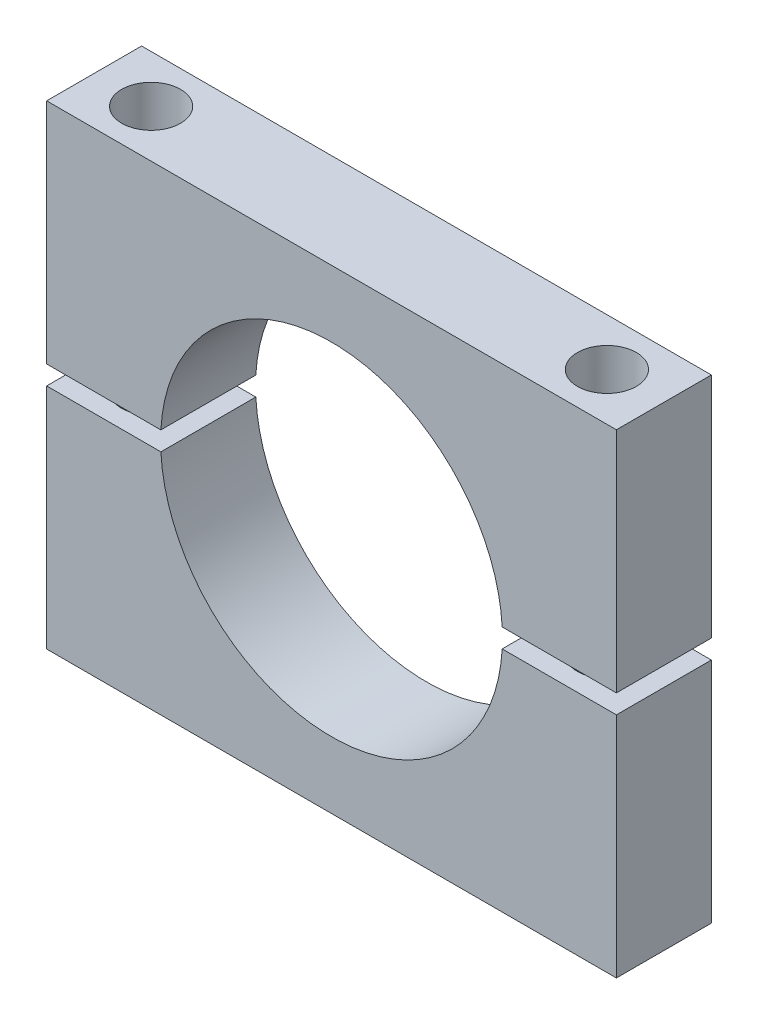
ISO-10303-21;
HEADER;
FILE_DESCRIPTION(('STEP AP214'),'2;1');
FILE_NAME('part.step','',(''),(''),'','','');
FILE_SCHEMA(('AUTOMOTIVE_DESIGN { 1 0 10303 214 1 1 1 1 }'));
ENDSEC;
DATA;
#1=APPLICATION_CONTEXT('core data for automotive mechanical design processes');
#2=APPLICATION_PROTOCOL_DEFINITION('international standard','automotive_design',2000,#1);
#3=PRODUCT_CONTEXT('',#1,'mechanical');
#4=PRODUCT('Part','Part','',(#3));
#5=PRODUCT_RELATED_PRODUCT_CATEGORY('part','',(#4));
#6=PRODUCT_DEFINITION_FORMATION('','',#4);
#7=PRODUCT_DEFINITION_CONTEXT('part definition',#1,'design');
#8=PRODUCT_DEFINITION('design','',#6,#7);
#9=PRODUCT_DEFINITION_SHAPE('','',#8);
#10=(LENGTH_UNIT() NAMED_UNIT(*) SI_UNIT(.MILLI.,.METRE.));
#11=(NAMED_UNIT(*) PLANE_ANGLE_UNIT() SI_UNIT($,.RADIAN.));
#12=(NAMED_UNIT(*) SI_UNIT($,.STERADIAN.) SOLID_ANGLE_UNIT());
#13=UNCERTAINTY_MEASURE_WITH_UNIT(LENGTH_MEASURE(1.E-05),#10,'distance_accuracy_value','');
#14=(GEOMETRIC_REPRESENTATION_CONTEXT(3) GLOBAL_UNCERTAINTY_ASSIGNED_CONTEXT((#13)) GLOBAL_UNIT_ASSIGNED_CONTEXT((#10,
#11,#12)) REPRESENTATION_CONTEXT('',''));
#15=CARTESIAN_POINT('',(0.,0.,0.));
#16=DIRECTION('',(0.,0.,1.));
#17=DIRECTION('',(1.,0.,0.));
#18=AXIS2_PLACEMENT_3D('',#15,#16,#17);
#19=CARTESIAN_POINT('',(15.,25.,2.5));
#20=DIRECTION('',(0.,0.,-1.));
#21=DIRECTION('',(-1.,0.,0.));
#22=AXIS2_PLACEMENT_3D('',#19,#20,#21);
#23=PLANE('',#22);
#24=DIRECTION('',(0.,-1.,0.));
#25=VECTOR('',#24,1.);
#26=CARTESIAN_POINT('',(-15.,25.,2.5));
#27=LINE('',#26,#25);
#28=CARTESIAN_POINT('',(-15.,25.,2.5));
#29=VERTEX_POINT('',#28);
#30=CARTESIAN_POINT('',(-15.,13.,2.5));
#31=VERTEX_POINT('',#30);
#32=EDGE_CURVE('E129',#29,#31,#27,.T.);
#33=ORIENTED_EDGE('',*,*,#32,.T.);
#34=DIRECTION('',(-1.,0.,0.));
#35=VECTOR('',#34,1.);
#36=CARTESIAN_POINT('',(-15.,13.,2.5));
#37=LINE('',#36,#35);
#38=CARTESIAN_POINT('',(-8.98610037780571,13.,2.5));
#39=VERTEX_POINT('',#38);
#40=EDGE_CURVE('E139',#39,#31,#37,.T.);
#41=ORIENTED_EDGE('',*,*,#40,.F.);
#42=CARTESIAN_POINT('',(0.,12.5,2.5));
#43=DIRECTION('',(0.,0.,1.));
#44=DIRECTION('',(1.,0.,0.));
#45=AXIS2_PLACEMENT_3D('',#42,#43,#44);
#46=CIRCLE('',#45,9.);
#47=CARTESIAN_POINT('',(8.98610037780572,13.,2.5));
#48=VERTEX_POINT('',#47);
#49=EDGE_CURVE('E137',#48,#39,#46,.T.);
#50=ORIENTED_EDGE('',*,*,#49,.F.);
#51=DIRECTION('',(-1.,0.,0.));
#52=VECTOR('',#51,1.);
#53=CARTESIAN_POINT('',(8.98610037780572,13.,2.5));
#54=LINE('',#53,#52);
#55=CARTESIAN_POINT('',(15.,13.,2.5));
#56=VERTEX_POINT('',#55);
#57=EDGE_CURVE('E12',#56,#48,#54,.T.);
#58=ORIENTED_EDGE('',*,*,#57,.F.);
#59=DIRECTION('',(0.,-1.,0.));
#60=VECTOR('',#59,1.);
#61=CARTESIAN_POINT('',(15.,25.,2.5));
#62=LINE('',#61,#60);
#63=CARTESIAN_POINT('',(15.,25.,2.5));
#64=VERTEX_POINT('',#63);
#65=EDGE_CURVE('E144',#64,#56,#62,.T.);
#66=ORIENTED_EDGE('',*,*,#65,.F.);
#67=DIRECTION('',(1.,0.,0.));
#68=VECTOR('',#67,1.);
#69=CARTESIAN_POINT('',(15.,25.,2.5));
#70=LINE('',#69,#68);
#71=EDGE_CURVE('E130',#29,#64,#70,.T.);
#72=ORIENTED_EDGE('',*,*,#71,.F.);
#73=EDGE_LOOP('',(#33,#41,#50,#58,#66,#72));
#74=FACE_BOUND('',#73,.T.);
#75=ADVANCED_FACE('F48',(#74),#23,.F.);
#76=CARTESIAN_POINT('',(15.,25.,2.5));
#77=DIRECTION('',(-1.,0.,0.));
#78=DIRECTION('',(0.,0.,1.));
#79=AXIS2_PLACEMENT_3D('',#76,#77,#78);
#80=PLANE('',#79);
#81=ORIENTED_EDGE('',*,*,#65,.T.);
#82=DIRECTION('',(0.,0.,1.));
#83=VECTOR('',#82,1.);
#84=CARTESIAN_POINT('',(15.,13.,-18.5));
#85=LINE('',#84,#83);
#86=CARTESIAN_POINT('',(15.,13.,-2.50000000000001));
#87=VERTEX_POINT('',#86);
#88=EDGE_CURVE('E58',#87,#56,#85,.T.);
#89=ORIENTED_EDGE('',*,*,#88,.F.);
#90=DIRECTION('',(0.,-1.,0.));
#91=VECTOR('',#90,1.);
#92=CARTESIAN_POINT('',(15.,25.,-2.5));
#93=LINE('',#92,#91);
#94=CARTESIAN_POINT('',(15.,25.,-2.5));
#95=VERTEX_POINT('',#94);
#96=EDGE_CURVE('E148',#95,#87,#93,.T.);
#97=ORIENTED_EDGE('',*,*,#96,.F.);
#98=DIRECTION('',(0.,0.,-1.));
#99=VECTOR('',#98,1.);
#100=CARTESIAN_POINT('',(15.,25.,2.5));
#101=LINE('',#100,#99);
#102=EDGE_CURVE('E116',#64,#95,#101,.T.);
#103=ORIENTED_EDGE('',*,*,#102,.F.);
#104=EDGE_LOOP('',(#81,#89,#97,#103));
#105=FACE_BOUND('',#104,.T.);
#106=ADVANCED_FACE('F166',(#105),#80,.F.);
#107=CARTESIAN_POINT('',(15.,25.,-2.5));
#108=DIRECTION('',(0.,0.,1.));
#109=DIRECTION('',(1.,0.,0.));
#110=AXIS2_PLACEMENT_3D('',#107,#108,#109);
#111=PLANE('',#110);
#112=CARTESIAN_POINT('',(0.,12.5,-2.5));
#113=DIRECTION('',(0.,0.,1.));
#114=DIRECTION('',(1.,0.,0.));
#115=AXIS2_PLACEMENT_3D('',#112,#113,#114);
#116=CIRCLE('',#115,9.);
#117=CARTESIAN_POINT('',(8.98610037780572,13.,-2.5));
#118=VERTEX_POINT('',#117);
#119=CARTESIAN_POINT('',(-8.98610037780571,13.,-2.50000000000001));
#120=VERTEX_POINT('',#119);
#121=EDGE_CURVE('E147',#118,#120,#116,.T.);
#122=ORIENTED_EDGE('',*,*,#121,.T.);
#123=DIRECTION('',(-1.,0.,0.));
#124=VECTOR('',#123,1.);
#125=CARTESIAN_POINT('',(15.,13.,-2.5));
#126=LINE('',#125,#124);
#127=CARTESIAN_POINT('',(-15.,13.,-2.50000000000001));
#128=VERTEX_POINT('',#127);
#129=EDGE_CURVE('E91',#120,#128,#126,.T.);
#130=ORIENTED_EDGE('',*,*,#129,.T.);
#131=DIRECTION('',(0.,-1.,0.));
#132=VECTOR('',#131,1.);
#133=CARTESIAN_POINT('',(-15.,25.,-2.5));
#134=LINE('',#133,#132);
#135=CARTESIAN_POINT('',(-15.,25.,-2.5));
#136=VERTEX_POINT('',#135);
#137=EDGE_CURVE('E123',#136,#128,#134,.T.);
#138=ORIENTED_EDGE('',*,*,#137,.F.);
#139=DIRECTION('',(-1.,0.,0.));
#140=VECTOR('',#139,1.);
#141=CARTESIAN_POINT('',(15.,25.,-2.5));
#142=LINE('',#141,#140);
#143=EDGE_CURVE('E109',#95,#136,#142,.T.);
#144=ORIENTED_EDGE('',*,*,#143,.F.);
#145=ORIENTED_EDGE('',*,*,#96,.T.);
#146=DIRECTION('',(-1.,0.,0.));
#147=VECTOR('',#146,1.);
#148=CARTESIAN_POINT('',(15.,13.,-2.5));
#149=LINE('',#148,#147);
#150=EDGE_CURVE('E67',#87,#118,#149,.T.);
#151=ORIENTED_EDGE('',*,*,#150,.T.);
#152=EDGE_LOOP('',(#122,#130,#138,#144,#145,#151));
#153=FACE_BOUND('',#152,.T.);
#154=ADVANCED_FACE('F125',(#153),#111,.F.);
#155=CARTESIAN_POINT('',(-15.,25.,2.5));
#156=DIRECTION('',(1.,0.,0.));
#157=DIRECTION('',(0.,0.,-1.));
#158=AXIS2_PLACEMENT_3D('',#155,#156,#157);
#159=PLANE('',#158);
#160=ORIENTED_EDGE('',*,*,#137,.T.);
#161=DIRECTION('',(0.,0.,1.));
#162=VECTOR('',#161,1.);
#163=CARTESIAN_POINT('',(-15.,13.,-18.5));
#164=LINE('',#163,#162);
#165=EDGE_CURVE('E94',#128,#31,#164,.T.);
#166=ORIENTED_EDGE('',*,*,#165,.T.);
#167=ORIENTED_EDGE('',*,*,#32,.F.);
#168=DIRECTION('',(0.,0.,1.));
#169=VECTOR('',#168,1.);
#170=CARTESIAN_POINT('',(-15.,25.,2.5));
#171=LINE('',#170,#169);
#172=EDGE_CURVE('E113',#136,#29,#171,.T.);
#173=ORIENTED_EDGE('',*,*,#172,.F.);
#174=EDGE_LOOP('',(#160,#166,#167,#173));
#175=FACE_BOUND('',#174,.T.);
#176=ADVANCED_FACE('F50',(#175),#159,.F.);
#177=CARTESIAN_POINT('',(0.,25.,0.));
#178=DIRECTION('',(0.,1.,0.));
#179=DIRECTION('',(0.,0.,1.));
#180=AXIS2_PLACEMENT_3D('',#177,#178,#179);
#181=PLANE('',#180);
#182=CARTESIAN_POINT('',(-12.,25.,0.));
#183=DIRECTION('',(0.,1.,0.));
#184=DIRECTION('',(0.,0.,1.));
#185=AXIS2_PLACEMENT_3D('',#182,#183,#184);
#186=CIRCLE('',#185,1.55);
#187=CARTESIAN_POINT('',(-12.,25.,1.55));
#188=VERTEX_POINT('',#187);
#189=EDGE_CURVE('E151',#188,#188,#186,.T.);
#190=ORIENTED_EDGE('',*,*,#189,.F.);
#191=EDGE_LOOP('',(#190));
#192=FACE_BOUND('',#191,.T.);
#193=CARTESIAN_POINT('',(12.,25.,0.));
#194=DIRECTION('',(0.,1.,0.));
#195=DIRECTION('',(0.,0.,-1.));
#196=AXIS2_PLACEMENT_3D('',#193,#194,#195);
#197=CIRCLE('',#196,1.55);
#198=CARTESIAN_POINT('',(12.,25.,-1.55));
#199=VERTEX_POINT('',#198);
#200=EDGE_CURVE('E156',#199,#199,#197,.T.);
#201=ORIENTED_EDGE('',*,*,#200,.F.);
#202=EDGE_LOOP('',(#201));
#203=FACE_BOUND('',#202,.T.);
#204=ORIENTED_EDGE('',*,*,#172,.T.);
#205=ORIENTED_EDGE('',*,*,#71,.T.);
#206=ORIENTED_EDGE('',*,*,#102,.T.);
#207=ORIENTED_EDGE('',*,*,#143,.T.);
#208=EDGE_LOOP('',(#204,#205,#206,#207));
#209=FACE_BOUND('',#208,.T.);
#210=ADVANCED_FACE('F111',(#192,#203,#209),#181,.T.);
#211=CARTESIAN_POINT('',(-15.,13.,-18.5));
#212=DIRECTION('',(0.,1.,0.));
#213=DIRECTION('',(-1.,0.,0.));
#214=AXIS2_PLACEMENT_3D('',#211,#212,#213);
#215=PLANE('',#214);
#216=CARTESIAN_POINT('',(-12.,13.,0.));
#217=DIRECTION('',(0.,1.,0.));
#218=DIRECTION('',(-1.,0.,0.));
#219=AXIS2_PLACEMENT_3D('',#216,#217,#218);
#220=CIRCLE('',#219,1.55);
#221=CARTESIAN_POINT('',(-13.55,13.,0.));
#222=VERTEX_POINT('',#221);
#223=EDGE_CURVE('E52',#222,#222,#220,.T.);
#224=ORIENTED_EDGE('',*,*,#223,.T.);
#225=EDGE_LOOP('',(#224));
#226=FACE_BOUND('',#225,.T.);
#227=DIRECTION('',(0.,0.,1.));
#228=VECTOR('',#227,1.);
#229=CARTESIAN_POINT('',(-8.98610037780571,13.,-18.5));
#230=LINE('',#229,#228);
#231=EDGE_CURVE('E120',#120,#39,#230,.T.);
#232=ORIENTED_EDGE('',*,*,#231,.T.);
#233=ORIENTED_EDGE('',*,*,#40,.T.);
#234=ORIENTED_EDGE('',*,*,#165,.F.);
#235=ORIENTED_EDGE('',*,*,#129,.F.);
#236=EDGE_LOOP('',(#232,#233,#234,#235));
#237=FACE_BOUND('',#236,.T.);
#238=ADVANCED_FACE('F174',(#226,#237),#215,.F.);
#239=CARTESIAN_POINT('',(0.,12.5,-18.5));
#240=DIRECTION('',(0.,0.,1.));
#241=DIRECTION('',(1.,0.,0.));
#242=AXIS2_PLACEMENT_3D('',#239,#240,#241);
#243=CYLINDRICAL_SURFACE('',#242,9.);
#244=DIRECTION('',(0.,0.,1.));
#245=VECTOR('',#244,1.);
#246=CARTESIAN_POINT('',(8.98610037780572,13.,-18.5));
#247=LINE('',#246,#245);
#248=EDGE_CURVE('E86',#118,#48,#247,.T.);
#249=ORIENTED_EDGE('',*,*,#248,.T.);
#250=ORIENTED_EDGE('',*,*,#49,.T.);
#251=ORIENTED_EDGE('',*,*,#231,.F.);
#252=ORIENTED_EDGE('',*,*,#121,.F.);
#253=EDGE_LOOP('',(#249,#250,#251,#252));
#254=FACE_BOUND('',#253,.T.);
#255=ADVANCED_FACE('F173',(#254),#243,.F.);
#256=CARTESIAN_POINT('',(8.98610037780572,13.,-18.5));
#257=DIRECTION('',(0.,1.,0.));
#258=DIRECTION('',(0.,0.,1.));
#259=AXIS2_PLACEMENT_3D('',#256,#257,#258);
#260=PLANE('',#259);
#261=CARTESIAN_POINT('',(12.,13.,0.));
#262=DIRECTION('',(0.,1.,0.));
#263=DIRECTION('',(0.,0.,1.));
#264=AXIS2_PLACEMENT_3D('',#261,#262,#263);
#265=CIRCLE('',#264,1.55);
#266=CARTESIAN_POINT('',(12.,13.,1.55));
#267=VERTEX_POINT('',#266);
#268=EDGE_CURVE('E149',#267,#267,#265,.T.);
#269=ORIENTED_EDGE('',*,*,#268,.T.);
#270=EDGE_LOOP('',(#269));
#271=FACE_BOUND('',#270,.T.);
#272=ORIENTED_EDGE('',*,*,#88,.T.);
#273=ORIENTED_EDGE('',*,*,#57,.T.);
#274=ORIENTED_EDGE('',*,*,#248,.F.);
#275=ORIENTED_EDGE('',*,*,#150,.F.);
#276=EDGE_LOOP('',(#272,#273,#274,#275));
#277=FACE_BOUND('',#276,.T.);
#278=ADVANCED_FACE('F169',(#271,#277),#260,.F.);
#279=CARTESIAN_POINT('',(12.,-16.,0.));
#280=DIRECTION('',(0.,1.,0.));
#281=DIRECTION('',(0.,0.,1.));
#282=AXIS2_PLACEMENT_3D('',#279,#280,#281);
#283=CYLINDRICAL_SURFACE('',#282,1.55);
#284=ORIENTED_EDGE('',*,*,#200,.T.);
#285=EDGE_LOOP('',(#284));
#286=FACE_BOUND('',#285,.T.);
#287=ORIENTED_EDGE('',*,*,#268,.F.);
#288=EDGE_LOOP('',(#287));
#289=FACE_BOUND('',#288,.T.);
#290=ADVANCED_FACE('F219',(#286,#289),#283,.F.);
#291=CARTESIAN_POINT('',(-12.,-16.,0.));
#292=DIRECTION('',(0.,1.,0.));
#293=DIRECTION('',(0.,0.,1.));
#294=AXIS2_PLACEMENT_3D('',#291,#292,#293);
#295=CYLINDRICAL_SURFACE('',#294,1.55);
#296=ORIENTED_EDGE('',*,*,#189,.T.);
#297=EDGE_LOOP('',(#296));
#298=FACE_BOUND('',#297,.T.);
#299=ORIENTED_EDGE('',*,*,#223,.F.);
#300=EDGE_LOOP('',(#299));
#301=FACE_BOUND('',#300,.T.);
#302=ADVANCED_FACE('F229',(#298,#301),#295,.F.);
#303=CLOSED_SHELL('',(#75,#106,#154,#176,#210,#238,#255,#278,#290,#302));
#304=MANIFOLD_SOLID_BREP('B2',#303);
#305=CARTESIAN_POINT('',(0.,0.,0.));
#306=DIRECTION('',(0.,1.,0.));
#307=DIRECTION('',(0.,0.,1.));
#308=AXIS2_PLACEMENT_3D('',#305,#306,#307);
#309=PLANE('',#308);
#310=CARTESIAN_POINT('',(-12.,0.,0.));
#311=DIRECTION('',(0.,1.,0.));
#312=DIRECTION('',(0.,0.,1.));
#313=AXIS2_PLACEMENT_3D('',#310,#311,#312);
#314=CIRCLE('',#313,1.55);
#315=CARTESIAN_POINT('',(-12.,0.,1.55));
#316=VERTEX_POINT('',#315);
#317=EDGE_CURVE('E390',#316,#316,#314,.T.);
#318=ORIENTED_EDGE('',*,*,#317,.T.);
#319=EDGE_LOOP('',(#318));
#320=FACE_BOUND('',#319,.T.);
#321=CARTESIAN_POINT('',(12.,0.,0.));
#322=DIRECTION('',(0.,1.,0.));
#323=DIRECTION('',(0.,0.,1.));
#324=AXIS2_PLACEMENT_3D('',#321,#322,#323);
#325=CIRCLE('',#324,1.55);
#326=CARTESIAN_POINT('',(12.,0.,1.55));
#327=VERTEX_POINT('',#326);
#328=EDGE_CURVE('E358',#327,#327,#325,.T.);
#329=ORIENTED_EDGE('',*,*,#328,.T.);
#330=EDGE_LOOP('',(#329));
#331=FACE_BOUND('',#330,.T.);
#332=DIRECTION('',(0.,0.,1.));
#333=VECTOR('',#332,1.);
#334=CARTESIAN_POINT('',(-15.,0.,2.5));
#335=LINE('',#334,#333);
#336=CARTESIAN_POINT('',(-15.,0.,-2.5));
#337=VERTEX_POINT('',#336);
#338=CARTESIAN_POINT('',(-15.,0.,2.5));
#339=VERTEX_POINT('',#338);
#340=EDGE_CURVE('E369',#337,#339,#335,.T.);
#341=ORIENTED_EDGE('',*,*,#340,.F.);
#342=DIRECTION('',(-1.,0.,0.));
#343=VECTOR('',#342,1.);
#344=CARTESIAN_POINT('',(15.,0.,-2.5));
#345=LINE('',#344,#343);
#346=CARTESIAN_POINT('',(15.,0.,-2.5));
#347=VERTEX_POINT('',#346);
#348=EDGE_CURVE('E379',#347,#337,#345,.T.);
#349=ORIENTED_EDGE('',*,*,#348,.F.);
#350=DIRECTION('',(0.,0.,-1.));
#351=VECTOR('',#350,1.);
#352=CARTESIAN_POINT('',(15.,0.,2.5));
#353=LINE('',#352,#351);
#354=CARTESIAN_POINT('',(15.,0.,2.5));
#355=VERTEX_POINT('',#354);
#356=EDGE_CURVE('E376',#355,#347,#353,.T.);
#357=ORIENTED_EDGE('',*,*,#356,.F.);
#358=DIRECTION('',(1.,0.,0.));
#359=VECTOR('',#358,1.);
#360=CARTESIAN_POINT('',(15.,0.,2.5));
#361=LINE('',#360,#359);
#362=EDGE_CURVE('E374',#339,#355,#361,.T.);
#363=ORIENTED_EDGE('',*,*,#362,.F.);
#364=EDGE_LOOP('',(#341,#349,#357,#363));
#365=FACE_BOUND('',#364,.T.);
#366=ADVANCED_FACE('F285',(#320,#331,#365),#309,.F.);
#367=CARTESIAN_POINT('',(15.,25.,-2.5));
#368=DIRECTION('',(0.,0.,1.));
#369=DIRECTION('',(1.,0.,0.));
#370=AXIS2_PLACEMENT_3D('',#367,#368,#369);
#371=PLANE('',#370);
#372=DIRECTION('',(0.,-1.,0.));
#373=VECTOR('',#372,1.);
#374=CARTESIAN_POINT('',(-15.,25.,-2.5));
#375=LINE('',#374,#373);
#376=CARTESIAN_POINT('',(-15.,12.,-2.50000000000001));
#377=VERTEX_POINT('',#376);
#378=EDGE_CURVE('E310',#377,#337,#375,.T.);
#379=ORIENTED_EDGE('',*,*,#378,.F.);
#380=DIRECTION('',(1.,0.,0.));
#381=VECTOR('',#380,1.);
#382=CARTESIAN_POINT('',(15.,12.,-2.5));
#383=LINE('',#382,#381);
#384=CARTESIAN_POINT('',(-8.98610037780571,12.,-2.50000000000001));
#385=VERTEX_POINT('',#384);
#386=EDGE_CURVE('E46',#377,#385,#383,.T.);
#387=ORIENTED_EDGE('',*,*,#386,.T.);
#388=CARTESIAN_POINT('',(0.,12.5,-2.5));
#389=DIRECTION('',(0.,0.,1.));
#390=DIRECTION('',(1.,0.,0.));
#391=AXIS2_PLACEMENT_3D('',#388,#389,#390);
#392=CIRCLE('',#391,9.);
#393=CARTESIAN_POINT('',(8.98610037780572,12.,-2.50000000000001));
#394=VERTEX_POINT('',#393);
#395=EDGE_CURVE('E294',#385,#394,#392,.T.);
#396=ORIENTED_EDGE('',*,*,#395,.T.);
#397=DIRECTION('',(1.,0.,0.));
#398=VECTOR('',#397,1.);
#399=CARTESIAN_POINT('',(15.,12.,-2.5));
#400=LINE('',#399,#398);
#401=CARTESIAN_POINT('',(15.,12.,-2.5));
#402=VERTEX_POINT('',#401);
#403=EDGE_CURVE('E345',#394,#402,#400,.T.);
#404=ORIENTED_EDGE('',*,*,#403,.T.);
#405=DIRECTION('',(0.,-1.,0.));
#406=VECTOR('',#405,1.);
#407=CARTESIAN_POINT('',(15.,25.,-2.5));
#408=LINE('',#407,#406);
#409=EDGE_CURVE('E382',#402,#347,#408,.T.);
#410=ORIENTED_EDGE('',*,*,#409,.T.);
#411=ORIENTED_EDGE('',*,*,#348,.T.);
#412=EDGE_LOOP('',(#379,#387,#396,#404,#410,#411));
#413=FACE_BOUND('',#412,.T.);
#414=ADVANCED_FACE('F416',(#413),#371,.F.);
#415=CARTESIAN_POINT('',(15.,25.,2.5));
#416=DIRECTION('',(-1.,0.,0.));
#417=DIRECTION('',(0.,0.,1.));
#418=AXIS2_PLACEMENT_3D('',#415,#416,#417);
#419=PLANE('',#418);
#420=ORIENTED_EDGE('',*,*,#409,.F.);
#421=DIRECTION('',(0.,0.,1.));
#422=VECTOR('',#421,1.);
#423=CARTESIAN_POINT('',(15.,12.,-18.5));
#424=LINE('',#423,#422);
#425=CARTESIAN_POINT('',(15.,12.,2.5));
#426=VERTEX_POINT('',#425);
#427=EDGE_CURVE('E302',#402,#426,#424,.T.);
#428=ORIENTED_EDGE('',*,*,#427,.T.);
#429=DIRECTION('',(0.,-1.,0.));
#430=VECTOR('',#429,1.);
#431=CARTESIAN_POINT('',(15.,25.,2.5));
#432=LINE('',#431,#430);
#433=EDGE_CURVE('E363',#426,#355,#432,.T.);
#434=ORIENTED_EDGE('',*,*,#433,.T.);
#435=ORIENTED_EDGE('',*,*,#356,.T.);
#436=EDGE_LOOP('',(#420,#428,#434,#435));
#437=FACE_BOUND('',#436,.T.);
#438=ADVANCED_FACE('F421',(#437),#419,.F.);
#439=CARTESIAN_POINT('',(15.,25.,2.5));
#440=DIRECTION('',(0.,0.,-1.));
#441=DIRECTION('',(-1.,0.,0.));
#442=AXIS2_PLACEMENT_3D('',#439,#440,#441);
#443=PLANE('',#442);
#444=CARTESIAN_POINT('',(0.,12.5,2.5));
#445=DIRECTION('',(0.,0.,1.));
#446=DIRECTION('',(1.,0.,0.));
#447=AXIS2_PLACEMENT_3D('',#444,#445,#446);
#448=CIRCLE('',#447,9.);
#449=CARTESIAN_POINT('',(-8.98610037780571,12.,2.5));
#450=VERTEX_POINT('',#449);
#451=CARTESIAN_POINT('',(8.98610037780572,12.,2.5));
#452=VERTEX_POINT('',#451);
#453=EDGE_CURVE('E351',#450,#452,#448,.T.);
#454=ORIENTED_EDGE('',*,*,#453,.F.);
#455=DIRECTION('',(1.,0.,0.));
#456=VECTOR('',#455,1.);
#457=CARTESIAN_POINT('',(-15.,12.,2.5));
#458=LINE('',#457,#456);
#459=CARTESIAN_POINT('',(-15.,12.,2.5));
#460=VERTEX_POINT('',#459);
#461=EDGE_CURVE('E348',#460,#450,#458,.T.);
#462=ORIENTED_EDGE('',*,*,#461,.F.);
#463=DIRECTION('',(0.,-1.,0.));
#464=VECTOR('',#463,1.);
#465=CARTESIAN_POINT('',(-15.,25.,2.5));
#466=LINE('',#465,#464);
#467=EDGE_CURVE('E385',#460,#339,#466,.T.);
#468=ORIENTED_EDGE('',*,*,#467,.T.);
#469=ORIENTED_EDGE('',*,*,#362,.T.);
#470=ORIENTED_EDGE('',*,*,#433,.F.);
#471=DIRECTION('',(1.,0.,0.));
#472=VECTOR('',#471,1.);
#473=CARTESIAN_POINT('',(8.98610037780572,12.,2.5));
#474=LINE('',#473,#472);
#475=EDGE_CURVE('E344',#452,#426,#474,.T.);
#476=ORIENTED_EDGE('',*,*,#475,.F.);
#477=EDGE_LOOP('',(#454,#462,#468,#469,#470,#476));
#478=FACE_BOUND('',#477,.T.);
#479=ADVANCED_FACE('F361',(#478),#443,.F.);
#480=CARTESIAN_POINT('',(-15.,25.,2.5));
#481=DIRECTION('',(1.,0.,0.));
#482=DIRECTION('',(0.,0.,-1.));
#483=AXIS2_PLACEMENT_3D('',#480,#481,#482);
#484=PLANE('',#483);
#485=ORIENTED_EDGE('',*,*,#467,.F.);
#486=DIRECTION('',(0.,0.,1.));
#487=VECTOR('',#486,1.);
#488=CARTESIAN_POINT('',(-15.,12.,-18.5));
#489=LINE('',#488,#487);
#490=EDGE_CURVE('E370',#377,#460,#489,.T.);
#491=ORIENTED_EDGE('',*,*,#490,.F.);
#492=ORIENTED_EDGE('',*,*,#378,.T.);
#493=ORIENTED_EDGE('',*,*,#340,.T.);
#494=EDGE_LOOP('',(#485,#491,#492,#493));
#495=FACE_BOUND('',#494,.T.);
#496=ADVANCED_FACE('F287',(#495),#484,.F.);
#497=CARTESIAN_POINT('',(8.98610037780572,12.,-18.5));
#498=DIRECTION('',(0.,-1.,0.));
#499=DIRECTION('',(1.,0.,0.));
#500=AXIS2_PLACEMENT_3D('',#497,#498,#499);
#501=PLANE('',#500);
#502=CARTESIAN_POINT('',(12.,12.,0.));
#503=DIRECTION('',(0.,-1.,0.));
#504=DIRECTION('',(1.,0.,0.));
#505=AXIS2_PLACEMENT_3D('',#502,#503,#504);
#506=CIRCLE('',#505,1.55);
#507=CARTESIAN_POINT('',(13.55,12.,0.));
#508=VERTEX_POINT('',#507);
#509=EDGE_CURVE('E289',#508,#508,#506,.T.);
#510=ORIENTED_EDGE('',*,*,#509,.T.);
#511=EDGE_LOOP('',(#510));
#512=FACE_BOUND('',#511,.T.);
#513=DIRECTION('',(0.,0.,1.));
#514=VECTOR('',#513,1.);
#515=CARTESIAN_POINT('',(8.98610037780572,12.,-18.5));
#516=LINE('',#515,#514);
#517=EDGE_CURVE('E340',#394,#452,#516,.T.);
#518=ORIENTED_EDGE('',*,*,#517,.T.);
#519=ORIENTED_EDGE('',*,*,#475,.T.);
#520=ORIENTED_EDGE('',*,*,#427,.F.);
#521=ORIENTED_EDGE('',*,*,#403,.F.);
#522=EDGE_LOOP('',(#518,#519,#520,#521));
#523=FACE_BOUND('',#522,.T.);
#524=ADVANCED_FACE('F342',(#512,#523),#501,.F.);
#525=CARTESIAN_POINT('',(-15.,12.,-18.5));
#526=DIRECTION('',(0.,-1.,0.));
#527=DIRECTION('',(1.,0.,0.));
#528=AXIS2_PLACEMENT_3D('',#525,#526,#527);
#529=PLANE('',#528);
#530=CARTESIAN_POINT('',(-12.,12.,0.));
#531=DIRECTION('',(0.,-1.,0.));
#532=DIRECTION('',(1.,0.,0.));
#533=AXIS2_PLACEMENT_3D('',#530,#531,#532);
#534=CIRCLE('',#533,1.55);
#535=CARTESIAN_POINT('',(-10.45,12.,0.));
#536=VERTEX_POINT('',#535);
#537=EDGE_CURVE('E388',#536,#536,#534,.T.);
#538=ORIENTED_EDGE('',*,*,#537,.T.);
#539=EDGE_LOOP('',(#538));
#540=FACE_BOUND('',#539,.T.);
#541=ORIENTED_EDGE('',*,*,#490,.T.);
#542=ORIENTED_EDGE('',*,*,#461,.T.);
#543=DIRECTION('',(0.,0.,1.));
#544=VECTOR('',#543,1.);
#545=CARTESIAN_POINT('',(-8.98610037780571,12.,-18.5));
#546=LINE('',#545,#544);
#547=EDGE_CURVE('E354',#385,#450,#546,.T.);
#548=ORIENTED_EDGE('',*,*,#547,.F.);
#549=ORIENTED_EDGE('',*,*,#386,.F.);
#550=EDGE_LOOP('',(#541,#542,#548,#549));
#551=FACE_BOUND('',#550,.T.);
#552=ADVANCED_FACE('F436',(#540,#551),#529,.F.);
#553=CARTESIAN_POINT('',(0.,12.5,-18.5));
#554=DIRECTION('',(0.,0.,1.));
#555=DIRECTION('',(1.,0.,0.));
#556=AXIS2_PLACEMENT_3D('',#553,#554,#555);
#557=CYLINDRICAL_SURFACE('',#556,9.);
#558=ORIENTED_EDGE('',*,*,#547,.T.);
#559=ORIENTED_EDGE('',*,*,#453,.T.);
#560=ORIENTED_EDGE('',*,*,#517,.F.);
#561=ORIENTED_EDGE('',*,*,#395,.F.);
#562=EDGE_LOOP('',(#558,#559,#560,#561));
#563=FACE_BOUND('',#562,.T.);
#564=ADVANCED_FACE('F352',(#563),#557,.F.);
#565=CARTESIAN_POINT('',(-12.,-16.,0.));
#566=DIRECTION('',(0.,1.,0.));
#567=DIRECTION('',(0.,0.,1.));
#568=AXIS2_PLACEMENT_3D('',#565,#566,#567);
#569=CYLINDRICAL_SURFACE('',#568,1.55);
#570=ORIENTED_EDGE('',*,*,#537,.F.);
#571=EDGE_LOOP('',(#570));
#572=FACE_BOUND('',#571,.T.);
#573=ORIENTED_EDGE('',*,*,#317,.F.);
#574=EDGE_LOOP('',(#573));
#575=FACE_BOUND('',#574,.T.);
#576=ADVANCED_FACE('F405',(#572,#575),#569,.F.);
#577=CARTESIAN_POINT('',(12.,-16.,0.));
#578=DIRECTION('',(0.,1.,0.));
#579=DIRECTION('',(0.,0.,1.));
#580=AXIS2_PLACEMENT_3D('',#577,#578,#579);
#581=CYLINDRICAL_SURFACE('',#580,1.55);
#582=ORIENTED_EDGE('',*,*,#509,.F.);
#583=EDGE_LOOP('',(#582));
#584=FACE_BOUND('',#583,.T.);
#585=ORIENTED_EDGE('',*,*,#328,.F.);
#586=EDGE_LOOP('',(#585));
#587=FACE_BOUND('',#586,.T.);
#588=ADVANCED_FACE('F403',(#584,#587),#581,.F.);
#589=CLOSED_SHELL('',(#366,#414,#438,#479,#496,#524,#552,#564,#576,#588));
#590=MANIFOLD_SOLID_BREP('B6',#589);
#591=ADVANCED_BREP_SHAPE_REPRESENTATION('',(#18,#304,#590),#14);
#592=SHAPE_DEFINITION_REPRESENTATION(#9,#591);
ENDSEC;
END-ISO-10303-21;
